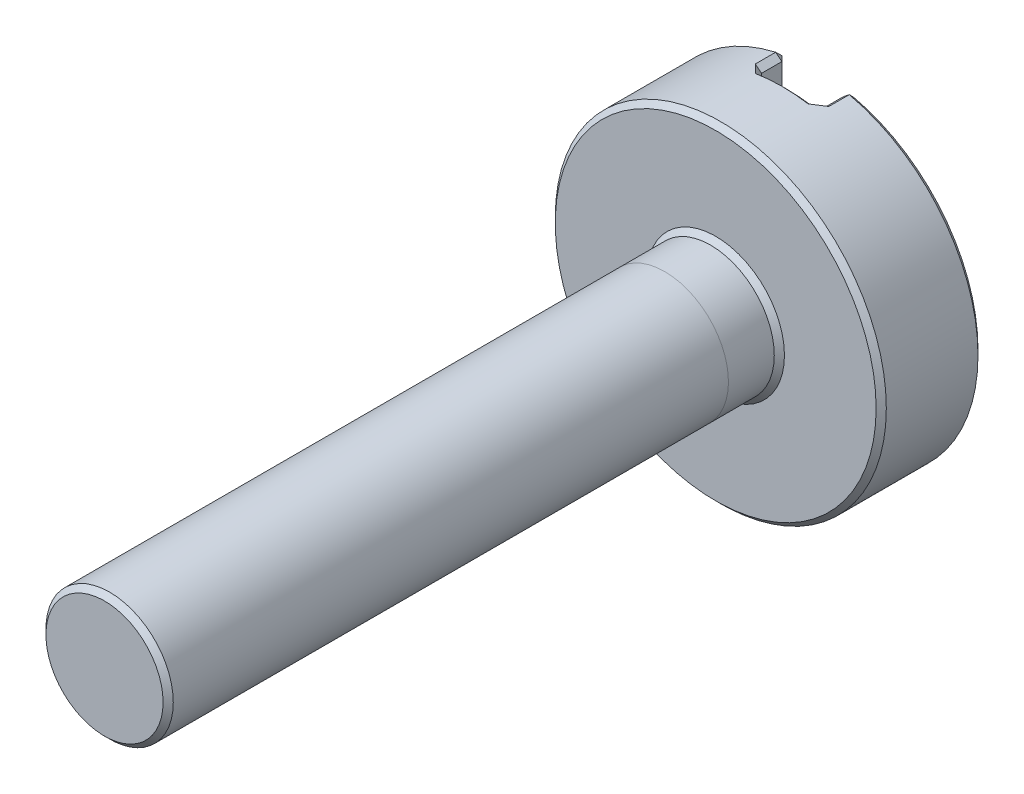
ISO-10303-21;
HEADER;
FILE_DESCRIPTION(('STEP AP214'),'2;1');
FILE_NAME('part.step','',(''),(''),'','','');
FILE_SCHEMA(('AUTOMOTIVE_DESIGN { 1 0 10303 214 1 1 1 1 }'));
ENDSEC;
DATA;
#1=APPLICATION_CONTEXT('core data for automotive mechanical design processes');
#2=APPLICATION_PROTOCOL_DEFINITION('international standard','automotive_design',2000,#1);
#3=PRODUCT_CONTEXT('',#1,'mechanical');
#4=PRODUCT('Part','Part','',(#3));
#5=PRODUCT_RELATED_PRODUCT_CATEGORY('part','',(#4));
#6=PRODUCT_DEFINITION_FORMATION('','',#4);
#7=PRODUCT_DEFINITION_CONTEXT('part definition',#1,'design');
#8=PRODUCT_DEFINITION('design','',#6,#7);
#9=PRODUCT_DEFINITION_SHAPE('','',#8);
#10=(LENGTH_UNIT() NAMED_UNIT(*) SI_UNIT(.MILLI.,.METRE.));
#11=(NAMED_UNIT(*) PLANE_ANGLE_UNIT() SI_UNIT($,.RADIAN.));
#12=(NAMED_UNIT(*) SI_UNIT($,.STERADIAN.) SOLID_ANGLE_UNIT());
#13=UNCERTAINTY_MEASURE_WITH_UNIT(LENGTH_MEASURE(1.E-05),#10,'distance_accuracy_value','');
#14=(GEOMETRIC_REPRESENTATION_CONTEXT(3) GLOBAL_UNCERTAINTY_ASSIGNED_CONTEXT((#13)) GLOBAL_UNIT_ASSIGNED_CONTEXT((#10,
#11,#12)) REPRESENTATION_CONTEXT('',''));
#15=CARTESIAN_POINT('',(0.,0.,0.));
#16=DIRECTION('',(0.,0.,1.));
#17=DIRECTION('',(1.,0.,0.));
#18=AXIS2_PLACEMENT_3D('',#15,#16,#17);
#19=CARTESIAN_POINT('',(0.,0.,7.));
#20=DIRECTION('',(0.,0.,-1.));
#21=DIRECTION('',(-1.,0.,0.));
#22=AXIS2_PLACEMENT_3D('',#19,#20,#21);
#23=CYLINDRICAL_SURFACE('',#22,0.625);
#24=CARTESIAN_POINT('',(0.,0.,6.95));
#25=DIRECTION('',(0.,0.,1.));
#26=DIRECTION('',(1.,0.,0.));
#27=AXIS2_PLACEMENT_3D('',#24,#25,#26);
#28=CIRCLE('',#27,0.625);
#29=CARTESIAN_POINT('',(0.625,0.,6.95));
#30=VERTEX_POINT('',#29);
#31=EDGE_CURVE('E204',#30,#30,#28,.F.);
#32=ORIENTED_EDGE('',*,*,#31,.T.);
#33=EDGE_LOOP('',(#32));
#34=FACE_BOUND('',#33,.T.);
#35=CARTESIAN_POINT('',(0.,0.,1.5));
#36=DIRECTION('',(0.,0.,-1.));
#37=DIRECTION('',(0.,1.,0.));
#38=AXIS2_PLACEMENT_3D('',#35,#36,#37);
#39=CIRCLE('',#38,0.625);
#40=CARTESIAN_POINT('',(0.,0.625,1.5));
#41=VERTEX_POINT('',#40);
#42=EDGE_CURVE('E11',#41,#41,#39,.T.);
#43=ORIENTED_EDGE('',*,*,#42,.F.);
#44=EDGE_LOOP('',(#43));
#45=FACE_BOUND('',#44,.T.);
#46=ADVANCED_FACE('F41',(#34,#45),#23,.T.);
#47=CARTESIAN_POINT('',(0.,0.,1.));
#48=DIRECTION('',(0.,0.,-1.));
#49=DIRECTION('',(-1.,0.,0.));
#50=AXIS2_PLACEMENT_3D('',#47,#48,#49);
#51=CYLINDRICAL_SURFACE('',#50,1.625);
#52=CARTESIAN_POINT('',(0.,0.,0.949999999999998));
#53=DIRECTION('',(0.,0.,1.));
#54=DIRECTION('',(1.,0.,0.));
#55=AXIS2_PLACEMENT_3D('',#52,#53,#54);
#56=CIRCLE('',#55,1.625);
#57=CARTESIAN_POINT('',(1.625,0.,0.949999999999998));
#58=VERTEX_POINT('',#57);
#59=EDGE_CURVE('E51',#58,#58,#56,.F.);
#60=ORIENTED_EDGE('',*,*,#59,.T.);
#61=EDGE_LOOP('',(#60));
#62=FACE_BOUND('',#61,.T.);
#63=CARTESIAN_POINT('',(-0.361111111111113,1.5843685699458,0.249999999999998));
#64=CARTESIAN_POINT('',(-0.352024673125165,1.58643929385841,0.259105473237547));
#65=CARTESIAN_POINT('',(-0.342896384422854,1.58843780195936,0.268185894910321));
#66=CARTESIAN_POINT('',(-0.324545861794149,1.5922886634834,0.286282585001724));
#67=CARTESIAN_POINT('',(-0.315323627628153,1.59414101653363,0.295298853256632));
#68=CARTESIAN_POINT('',(-0.290172859079825,1.59896384129641,0.31964375448623));
#69=CARTESIAN_POINT('',(-0.274143799850216,1.60179156232275,0.334896855879139));
#70=CARTESIAN_POINT('',(-0.257936507959199,1.604398254138,0.349999999985659));
#71=B_SPLINE_CURVE_WITH_KNOTS('',3,(#63,#64,#65,#66,#67,#68,#69,#70),.UNSPECIFIED.,.F.,.F.,(4,2,
2,4),(0.,0.0390877212349878,0.0781755421865645,0.145089052870149),.UNSPECIFIED.);
#72=CARTESIAN_POINT('',(-0.361111111111113,1.5843685699458,0.249999999999998));
#73=VERTEX_POINT('',#72);
#74=CARTESIAN_POINT('',(-0.257936507936506,1.60439825413565,0.350000000000002));
#75=VERTEX_POINT('',#74);
#76=EDGE_CURVE('E532',#73,#75,#71,.T.);
#77=ORIENTED_EDGE('',*,*,#76,.F.);
#78=DIRECTION('',(0.,0.,-1.));
#79=VECTOR('',#78,1.);
#80=CARTESIAN_POINT('',(-0.361111111111113,1.5843685699458,1.));
#81=LINE('',#80,#79);
#82=CARTESIAN_POINT('',(-0.361111111111113,1.5843685699458,0.0500000000000016));
#83=VERTEX_POINT('',#82);
#84=EDGE_CURVE('E538',#73,#83,#81,.T.);
#85=ORIENTED_EDGE('',*,*,#84,.T.);
#86=CARTESIAN_POINT('',(0.,0.,0.0500000000000016));
#87=DIRECTION('',(0.,0.,1.));
#88=DIRECTION('',(1.,0.,0.));
#89=AXIS2_PLACEMENT_3D('',#86,#87,#88);
#90=CIRCLE('',#89,1.625);
#91=CARTESIAN_POINT('',(-0.361111111111113,-1.5843685699458,0.0500000000000016));
#92=VERTEX_POINT('',#91);
#93=EDGE_CURVE('E618',#83,#92,#90,.T.);
#94=ORIENTED_EDGE('',*,*,#93,.T.);
#95=DIRECTION('',(0.,0.,-1.));
#96=VECTOR('',#95,1.);
#97=CARTESIAN_POINT('',(-0.361111111111113,-1.5843685699458,1.));
#98=LINE('',#97,#96);
#99=CARTESIAN_POINT('',(-0.361111111111113,-1.5843685699458,0.249999999999998));
#100=VERTEX_POINT('',#99);
#101=EDGE_CURVE('E580',#92,#100,#98,.F.);
#102=ORIENTED_EDGE('',*,*,#101,.T.);
#103=CARTESIAN_POINT('',(-0.257936507936506,-1.60439825413565,0.350000000000002));
#104=CARTESIAN_POINT('',(-0.267404743278861,-1.60287577243136,0.341179009821983));
#105=CARTESIAN_POINT('',(-0.27681149504785,-1.60127770693172,0.33230569639603));
#106=CARTESIAN_POINT('',(-0.29551300919929,-1.59793229896715,0.314469692080766));
#107=CARTESIAN_POINT('',(-0.304807772175425,-1.59618495729396,0.305507001665728));
#108=CARTESIAN_POINT('',(-0.329877062693198,-1.59124653917794,0.281100804078021));
#109=CARTESIAN_POINT('',(-0.345554186823829,-1.587913184409,0.265585674105172));
#110=CARTESIAN_POINT('',(-0.361111111119896,-1.58436856994723,0.24999999999455));
#111=B_SPLINE_CURVE_WITH_KNOTS('',3,(#103,#104,#105,#106,#107,#108,#109,#110),.UNSPECIFIED.,.F.,
.F.,(4,2,2,4),(0.,0.0390881748208134,0.0781761423329269,0.145089369453429),.UNSPECIFIED.);
#112=CARTESIAN_POINT('',(-0.257936507936506,-1.60439825413565,0.350000000000002));
#113=VERTEX_POINT('',#112);
#114=EDGE_CURVE('E573',#113,#100,#111,.T.);
#115=ORIENTED_EDGE('',*,*,#114,.F.);
#116=CARTESIAN_POINT('',(0.,0.,0.350000000000002));
#117=DIRECTION('',(0.,0.,-1.));
#118=DIRECTION('',(-1.,0.,0.));
#119=AXIS2_PLACEMENT_3D('',#116,#117,#118);
#120=CIRCLE('',#119,1.625);
#121=CARTESIAN_POINT('',(0.257936507936506,-1.60439825413565,0.350000000000002));
#122=VERTEX_POINT('',#121);
#123=EDGE_CURVE('E632',#113,#122,#120,.F.);
#124=ORIENTED_EDGE('',*,*,#123,.T.);
#125=CARTESIAN_POINT('',(0.361111111111113,-1.5843685699458,0.249999999999998));
#126=CARTESIAN_POINT('',(0.352024673125165,-1.58643929385841,0.259105473237547));
#127=CARTESIAN_POINT('',(0.342896384422854,-1.58843780195936,0.268185894910321));
#128=CARTESIAN_POINT('',(0.324545861794149,-1.5922886634834,0.286282585001724));
#129=CARTESIAN_POINT('',(0.315323627628153,-1.59414101653363,0.295298853256632));
#130=CARTESIAN_POINT('',(0.290172859079825,-1.59896384129641,0.31964375448623));
#131=CARTESIAN_POINT('',(0.274143799850216,-1.60179156232275,0.334896855879139));
#132=CARTESIAN_POINT('',(0.257936507959199,-1.604398254138,0.349999999985659));
#133=B_SPLINE_CURVE_WITH_KNOTS('',3,(#125,#126,#127,#128,#129,#130,#131,#132),.UNSPECIFIED.,.F.,
.F.,(4,2,2,4),(0.,0.0390877212349878,0.0781755421865645,0.145089052870149),.UNSPECIFIED.);
#134=CARTESIAN_POINT('',(0.361111111111113,-1.5843685699458,0.249999999999998));
#135=VERTEX_POINT('',#134);
#136=EDGE_CURVE('E148',#135,#122,#133,.T.);
#137=ORIENTED_EDGE('',*,*,#136,.F.);
#138=DIRECTION('',(0.,0.,-1.));
#139=VECTOR('',#138,1.);
#140=CARTESIAN_POINT('',(0.361111111111113,-1.5843685699458,1.));
#141=LINE('',#140,#139);
#142=CARTESIAN_POINT('',(0.361111111111113,-1.5843685699458,0.0500000000000016));
#143=VERTEX_POINT('',#142);
#144=EDGE_CURVE('E143',#135,#143,#141,.T.);
#145=ORIENTED_EDGE('',*,*,#144,.T.);
#146=CARTESIAN_POINT('',(0.,0.,0.0500000000000016));
#147=DIRECTION('',(0.,0.,1.));
#148=DIRECTION('',(1.,0.,0.));
#149=AXIS2_PLACEMENT_3D('',#146,#147,#148);
#150=CIRCLE('',#149,1.625);
#151=CARTESIAN_POINT('',(0.361111111111113,1.5843685699458,0.0500000000000016));
#152=VERTEX_POINT('',#151);
#153=EDGE_CURVE('E146',#143,#152,#150,.T.);
#154=ORIENTED_EDGE('',*,*,#153,.T.);
#155=DIRECTION('',(0.,0.,-1.));
#156=VECTOR('',#155,1.);
#157=CARTESIAN_POINT('',(0.361111111111113,1.5843685699458,1.));
#158=LINE('',#157,#156);
#159=CARTESIAN_POINT('',(0.361111111111113,1.5843685699458,0.249999999999998));
#160=VERTEX_POINT('',#159);
#161=EDGE_CURVE('E153',#152,#160,#158,.F.);
#162=ORIENTED_EDGE('',*,*,#161,.T.);
#163=CARTESIAN_POINT('',(0.257936507936506,1.60439825413565,0.350000000000002));
#164=CARTESIAN_POINT('',(0.267404743278861,1.60287577243136,0.341179009821983));
#165=CARTESIAN_POINT('',(0.27681149504785,1.60127770693172,0.33230569639603));
#166=CARTESIAN_POINT('',(0.29551300919929,1.59793229896715,0.314469692080766));
#167=CARTESIAN_POINT('',(0.304807772175425,1.59618495729396,0.305507001665728));
#168=CARTESIAN_POINT('',(0.329877062693198,1.59124653917794,0.281100804078021));
#169=CARTESIAN_POINT('',(0.345554186823829,1.587913184409,0.265585674105172));
#170=CARTESIAN_POINT('',(0.361111111119896,1.58436856994723,0.24999999999455));
#171=B_SPLINE_CURVE_WITH_KNOTS('',3,(#163,#164,#165,#166,#167,#168,#169,#170),.UNSPECIFIED.,.F.,
.F.,(4,2,2,4),(0.,0.0390881748208134,0.0781761423329269,0.145089369453429),.UNSPECIFIED.);
#172=CARTESIAN_POINT('',(0.257936507936506,1.60439825413565,0.350000000000002));
#173=VERTEX_POINT('',#172);
#174=EDGE_CURVE('E566',#173,#160,#171,.T.);
#175=ORIENTED_EDGE('',*,*,#174,.F.);
#176=CARTESIAN_POINT('',(0.,0.,0.350000000000002));
#177=DIRECTION('',(0.,0.,-1.));
#178=DIRECTION('',(-1.,0.,0.));
#179=AXIS2_PLACEMENT_3D('',#176,#177,#178);
#180=CIRCLE('',#179,1.625);
#181=EDGE_CURVE('E412',#173,#75,#180,.F.);
#182=ORIENTED_EDGE('',*,*,#181,.T.);
#183=EDGE_LOOP('',(#77,#85,#94,#102,#115,#124,#137,#145,#154,#162,#175,#182));
#184=FACE_BOUND('',#183,.T.);
#185=ADVANCED_FACE('F145',(#62,#184),#51,.T.);
#186=CARTESIAN_POINT('',(0.,0.,0.));
#187=DIRECTION('',(0.,0.,1.));
#188=DIRECTION('',(1.,0.,0.));
#189=AXIS2_PLACEMENT_3D('',#186,#187,#188);
#190=PLANE('',#189);
#191=CARTESIAN_POINT('',(0.,0.,0.));
#192=DIRECTION('',(0.,0.,1.));
#193=DIRECTION('',(1.,0.,0.));
#194=AXIS2_PLACEMENT_3D('',#191,#192,#193);
#195=CIRCLE('',#194,1.575);
#196=CARTESIAN_POINT('',(0.350000000000001,1.53561876779362,0.));
#197=VERTEX_POINT('',#196);
#198=CARTESIAN_POINT('',(0.350000000000001,-1.53561876779362,0.));
#199=VERTEX_POINT('',#198);
#200=EDGE_CURVE('E57',#197,#199,#195,.F.);
#201=ORIENTED_EDGE('',*,*,#200,.T.);
#202=DIRECTION('',(0.,1.,0.));
#203=VECTOR('',#202,1.);
#204=CARTESIAN_POINT('',(0.350000000000001,0.,0.));
#205=LINE('',#204,#203);
#206=EDGE_CURVE('E201',#199,#197,#205,.T.);
#207=ORIENTED_EDGE('',*,*,#206,.T.);
#208=EDGE_LOOP('',(#201,#207));
#209=FACE_BOUND('',#208,.T.);
#210=ADVANCED_FACE('F236',(#209),#190,.F.);
#211=ORIENTED_EDGE('',*,*,#42,.T.);
#212=EDGE_LOOP('',(#211));
#213=FACE_BOUND('',#212,.T.);
#214=CARTESIAN_POINT('',(0.,0.,1.05));
#215=DIRECTION('',(0.,0.,1.));
#216=DIRECTION('',(1.,0.,0.));
#217=AXIS2_PLACEMENT_3D('',#214,#215,#216);
#218=CIRCLE('',#217,0.625);
#219=CARTESIAN_POINT('',(0.625,0.,1.05));
#220=VERTEX_POINT('',#219);
#221=EDGE_CURVE('E200',#220,#220,#218,.T.);
#222=ORIENTED_EDGE('',*,*,#221,.T.);
#223=EDGE_LOOP('',(#222));
#224=FACE_BOUND('',#223,.T.);
#225=ADVANCED_FACE('F234',(#213,#224),#23,.T.);
#226=CARTESIAN_POINT('',(0.,0.,7.));
#227=DIRECTION('',(0.,0.,1.));
#228=DIRECTION('',(1.,0.,0.));
#229=AXIS2_PLACEMENT_3D('',#226,#227,#228);
#230=PLANE('',#229);
#231=CARTESIAN_POINT('',(0.,0.,7.));
#232=DIRECTION('',(0.,0.,1.));
#233=DIRECTION('',(1.,0.,0.));
#234=AXIS2_PLACEMENT_3D('',#231,#232,#233);
#235=CIRCLE('',#234,0.575);
#236=CARTESIAN_POINT('',(0.575,0.,7.));
#237=VERTEX_POINT('',#236);
#238=EDGE_CURVE('E197',#237,#237,#235,.T.);
#239=ORIENTED_EDGE('',*,*,#238,.T.);
#240=EDGE_LOOP('',(#239));
#241=FACE_BOUND('',#240,.T.);
#242=ADVANCED_FACE('F226',(#241),#230,.T.);
#243=CARTESIAN_POINT('',(0.,0.,1.));
#244=DIRECTION('',(0.,0.,1.));
#245=DIRECTION('',(1.,0.,0.));
#246=AXIS2_PLACEMENT_3D('',#243,#244,#245);
#247=PLANE('',#246);
#248=CARTESIAN_POINT('',(0.,0.,1.));
#249=DIRECTION('',(0.,0.,1.));
#250=DIRECTION('',(1.,0.,0.));
#251=AXIS2_PLACEMENT_3D('',#248,#249,#250);
#252=CIRCLE('',#251,1.575);
#253=CARTESIAN_POINT('',(1.575,0.,1.));
#254=VERTEX_POINT('',#253);
#255=EDGE_CURVE('E210',#254,#254,#252,.T.);
#256=ORIENTED_EDGE('',*,*,#255,.T.);
#257=EDGE_LOOP('',(#256));
#258=FACE_BOUND('',#257,.T.);
#259=CARTESIAN_POINT('',(0.,0.,1.));
#260=DIRECTION('',(0.,0.,1.));
#261=DIRECTION('',(1.,0.,0.));
#262=AXIS2_PLACEMENT_3D('',#259,#260,#261);
#263=CIRCLE('',#262,0.675);
#264=CARTESIAN_POINT('',(0.675,0.,1.));
#265=VERTEX_POINT('',#264);
#266=EDGE_CURVE('E207',#265,#265,#263,.F.);
#267=ORIENTED_EDGE('',*,*,#266,.T.);
#268=EDGE_LOOP('',(#267));
#269=FACE_BOUND('',#268,.T.);
#270=ADVANCED_FACE('F222',(#258,#269),#247,.T.);
#271=CARTESIAN_POINT('',(0.,0.,0.));
#272=DIRECTION('',(0.,0.,1.));
#273=DIRECTION('',(1.,0.,0.));
#274=AXIS2_PLACEMENT_3D('',#271,#272,#273);
#275=CIRCLE('',#274,1.575);
#276=CARTESIAN_POINT('',(-0.350000000000001,-1.53561876779362,0.));
#277=VERTEX_POINT('',#276);
#278=CARTESIAN_POINT('',(-0.350000000000001,1.53561876779362,0.));
#279=VERTEX_POINT('',#278);
#280=EDGE_CURVE('E430',#277,#279,#275,.F.);
#281=ORIENTED_EDGE('',*,*,#280,.T.);
#282=DIRECTION('',(0.,-1.,0.));
#283=VECTOR('',#282,1.);
#284=CARTESIAN_POINT('',(-0.350000000000001,0.,0.));
#285=LINE('',#284,#283);
#286=EDGE_CURVE('E432',#279,#277,#285,.T.);
#287=ORIENTED_EDGE('',*,*,#286,.T.);
#288=EDGE_LOOP('',(#281,#287));
#289=FACE_BOUND('',#288,.T.);
#290=ADVANCED_FACE('F225',(#289),#190,.F.);
#291=CARTESIAN_POINT('',(0.,0.,0.3));
#292=DIRECTION('',(0.,0.,-1.));
#293=DIRECTION('',(-1.,0.,0.));
#294=AXIS2_PLACEMENT_3D('',#291,#292,#293);
#295=PLANE('',#294);
#296=CARTESIAN_POINT('',(0.,0.,0.3));
#297=DIRECTION('',(0.,0.,-1.));
#298=DIRECTION('',(-1.,0.,0.));
#299=AXIS2_PLACEMENT_3D('',#296,#297,#298);
#300=CIRCLE('',#299,1.575);
#301=CARTESIAN_POINT('',(0.249999999999998,-1.5550321540084,0.3));
#302=VERTEX_POINT('',#301);
#303=CARTESIAN_POINT('',(-0.249999999999998,-1.5550321540084,0.3));
#304=VERTEX_POINT('',#303);
#305=EDGE_CURVE('E421',#302,#304,#300,.T.);
#306=ORIENTED_EDGE('',*,*,#305,.T.);
#307=DIRECTION('',(0.,1.,0.));
#308=VECTOR('',#307,1.);
#309=CARTESIAN_POINT('',(-0.249999999999998,0.,0.3));
#310=LINE('',#309,#308);
#311=CARTESIAN_POINT('',(-0.249999999999998,1.5550321540084,0.3));
#312=VERTEX_POINT('',#311);
#313=EDGE_CURVE('E423',#304,#312,#310,.T.);
#314=ORIENTED_EDGE('',*,*,#313,.T.);
#315=CARTESIAN_POINT('',(0.,0.,0.3));
#316=DIRECTION('',(0.,0.,-1.));
#317=DIRECTION('',(-1.,0.,0.));
#318=AXIS2_PLACEMENT_3D('',#315,#316,#317);
#319=CIRCLE('',#318,1.575);
#320=CARTESIAN_POINT('',(0.249999999999998,1.5550321540084,0.3));
#321=VERTEX_POINT('',#320);
#322=EDGE_CURVE('E410',#312,#321,#319,.T.);
#323=ORIENTED_EDGE('',*,*,#322,.T.);
#324=DIRECTION('',(0.,-1.,0.));
#325=VECTOR('',#324,1.);
#326=CARTESIAN_POINT('',(0.249999999999998,0.,0.3));
#327=LINE('',#326,#325);
#328=EDGE_CURVE('E418',#321,#302,#327,.T.);
#329=ORIENTED_EDGE('',*,*,#328,.T.);
#330=EDGE_LOOP('',(#306,#314,#323,#329));
#331=FACE_BOUND('',#330,.T.);
#332=ADVANCED_FACE('F668',(#331),#295,.T.);
#333=CARTESIAN_POINT('',(0.3,-2.97219755952938,0.3));
#334=DIRECTION('',(1.,0.,0.));
#335=DIRECTION('',(0.,0.,-1.));
#336=AXIS2_PLACEMENT_3D('',#333,#334,#335);
#337=PLANE('',#336);
#338=DIRECTION('',(0.,0.,1.));
#339=VECTOR('',#338,1.);
#340=CARTESIAN_POINT('',(0.3,-1.53561876779362,0.3));
#341=LINE('',#340,#339);
#342=CARTESIAN_POINT('',(0.3,-1.53561876779362,0.0500000000000016));
#343=VERTEX_POINT('',#342);
#344=CARTESIAN_POINT('',(0.3,-1.53561876779362,0.249999999999998));
#345=VERTEX_POINT('',#344);
#346=EDGE_CURVE('E173',#343,#345,#341,.T.);
#347=ORIENTED_EDGE('',*,*,#346,.T.);
#348=DIRECTION('',(0.,1.,0.));
#349=VECTOR('',#348,1.);
#350=CARTESIAN_POINT('',(0.3,-2.97219755952938,0.249999999999998));
#351=LINE('',#350,#349);
#352=CARTESIAN_POINT('',(0.3,1.53561876779362,0.249999999999998));
#353=VERTEX_POINT('',#352);
#354=EDGE_CURVE('E425',#345,#353,#351,.T.);
#355=ORIENTED_EDGE('',*,*,#354,.T.);
#356=DIRECTION('',(0.,0.,-1.));
#357=VECTOR('',#356,1.);
#358=CARTESIAN_POINT('',(0.3,1.53561876779362,0.3));
#359=LINE('',#358,#357);
#360=CARTESIAN_POINT('',(0.3,1.53561876779362,0.0500000000000016));
#361=VERTEX_POINT('',#360);
#362=EDGE_CURVE('E658',#353,#361,#359,.T.);
#363=ORIENTED_EDGE('',*,*,#362,.T.);
#364=DIRECTION('',(0.,-1.,0.));
#365=VECTOR('',#364,1.);
#366=CARTESIAN_POINT('',(0.3,-2.97219755952938,0.0500000000000016));
#367=LINE('',#366,#365);
#368=EDGE_CURVE('E654',#361,#343,#367,.T.);
#369=ORIENTED_EDGE('',*,*,#368,.T.);
#370=EDGE_LOOP('',(#347,#355,#363,#369));
#371=FACE_BOUND('',#370,.T.);
#372=ADVANCED_FACE('F662',(#371),#337,.F.);
#373=CARTESIAN_POINT('',(-0.3,-2.97219755952938,0.3));
#374=DIRECTION('',(-1.,0.,0.));
#375=DIRECTION('',(0.,0.,1.));
#376=AXIS2_PLACEMENT_3D('',#373,#374,#375);
#377=PLANE('',#376);
#378=DIRECTION('',(0.,0.,1.));
#379=VECTOR('',#378,1.);
#380=CARTESIAN_POINT('',(-0.3,1.53561876779362,0.3));
#381=LINE('',#380,#379);
#382=CARTESIAN_POINT('',(-0.3,1.53561876779362,0.0500000000000016));
#383=VERTEX_POINT('',#382);
#384=CARTESIAN_POINT('',(-0.3,1.53561876779362,0.249999999999998));
#385=VERTEX_POINT('',#384);
#386=EDGE_CURVE('E540',#383,#385,#381,.T.);
#387=ORIENTED_EDGE('',*,*,#386,.T.);
#388=DIRECTION('',(0.,-1.,0.));
#389=VECTOR('',#388,1.);
#390=CARTESIAN_POINT('',(-0.3,-2.97219755952938,0.249999999999998));
#391=LINE('',#390,#389);
#392=CARTESIAN_POINT('',(-0.3,-1.53561876779362,0.249999999999998));
#393=VERTEX_POINT('',#392);
#394=EDGE_CURVE('E652',#385,#393,#391,.T.);
#395=ORIENTED_EDGE('',*,*,#394,.T.);
#396=DIRECTION('',(0.,0.,-1.));
#397=VECTOR('',#396,1.);
#398=CARTESIAN_POINT('',(-0.3,-1.53561876779362,0.3));
#399=LINE('',#398,#397);
#400=CARTESIAN_POINT('',(-0.3,-1.53561876779362,0.0500000000000016));
#401=VERTEX_POINT('',#400);
#402=EDGE_CURVE('E650',#393,#401,#399,.T.);
#403=ORIENTED_EDGE('',*,*,#402,.T.);
#404=DIRECTION('',(0.,1.,0.));
#405=VECTOR('',#404,1.);
#406=CARTESIAN_POINT('',(-0.3,-2.97219755952938,0.0500000000000016));
#407=LINE('',#406,#405);
#408=EDGE_CURVE('E537',#401,#383,#407,.T.);
#409=ORIENTED_EDGE('',*,*,#408,.T.);
#410=EDGE_LOOP('',(#387,#395,#403,#409));
#411=FACE_BOUND('',#410,.T.);
#412=ADVANCED_FACE('F286',(#411),#377,.F.);
#413=CARTESIAN_POINT('',(0.3,1.53561876779362,0.0500000000000016));
#414=DIRECTION('',(-0.529150262212924,0.663324958071088,-0.529150262212902));
#415=DIRECTION('',(-0.781735959970572,-0.623609564462323,0.));
#416=AXIS2_PLACEMENT_3D('',#413,#414,#415);
#417=PLANE('',#416);
#418=DIRECTION('',(0.781735959970572,0.623609564462323,0.));
#419=VECTOR('',#418,1.);
#420=CARTESIAN_POINT('',(0.3,1.53561876779362,0.0500000000000016));
#421=LINE('',#420,#419);
#422=EDGE_CURVE('E169',#152,#361,#421,.F.);
#423=ORIENTED_EDGE('',*,*,#422,.F.);
#424=DIRECTION('',(-0.157134840263692,-0.68942631366615,-0.707106781186552));
#425=VECTOR('',#424,1.);
#426=CARTESIAN_POINT('',(0.,0.,-1.57500000000003));
#427=LINE('',#426,#425);
#428=EDGE_CURVE('E159',#197,#152,#427,.F.);
#429=ORIENTED_EDGE('',*,*,#428,.F.);
#430=DIRECTION('',(0.707106781186543,0.,-0.707106781186552));
#431=VECTOR('',#430,1.);
#432=CARTESIAN_POINT('',(0.3,1.53561876779362,0.0500000000000016));
#433=LINE('',#432,#431);
#434=EDGE_CURVE('E193',#361,#197,#433,.T.);
#435=ORIENTED_EDGE('',*,*,#434,.F.);
#436=EDGE_LOOP('',(#423,#429,#435));
#437=FACE_BOUND('',#436,.T.);
#438=ADVANCED_FACE('F275',(#437),#417,.T.);
#439=CARTESIAN_POINT('',(0.,0.,0.0500000000000016));
#440=DIRECTION('',(0.,0.,1.));
#441=DIRECTION('',(1.,0.,0.));
#442=AXIS2_PLACEMENT_3D('',#439,#440,#441);
#443=CONICAL_SURFACE('',#442,1.625,0.785398163397442);
#444=ORIENTED_EDGE('',*,*,#428,.T.);
#445=ORIENTED_EDGE('',*,*,#153,.F.);
#446=DIRECTION('',(0.157134840263692,-0.68942631366615,0.707106781186552));
#447=VECTOR('',#446,1.);
#448=CARTESIAN_POINT('',(0.,0.,-1.57500000000003));
#449=LINE('',#448,#447);
#450=EDGE_CURVE('E157',#199,#143,#449,.T.);
#451=ORIENTED_EDGE('',*,*,#450,.F.);
#452=ORIENTED_EDGE('',*,*,#200,.F.);
#453=EDGE_LOOP('',(#444,#445,#451,#452));
#454=FACE_BOUND('',#453,.T.);
#455=ADVANCED_FACE('F156',(#454),#443,.T.);
#456=CARTESIAN_POINT('',(0.350000000000001,0.,0.));
#457=DIRECTION('',(0.707106781186552,0.,0.707106781186543));
#458=DIRECTION('',(0.,1.,0.));
#459=AXIS2_PLACEMENT_3D('',#456,#457,#458);
#460=PLANE('',#459);
#461=ORIENTED_EDGE('',*,*,#434,.T.);
#462=ORIENTED_EDGE('',*,*,#206,.F.);
#463=DIRECTION('',(-0.707106781186543,0.,0.707106781186552));
#464=VECTOR('',#463,1.);
#465=CARTESIAN_POINT('',(0.330555555555557,-1.53561876779362,0.0194444444444444));
#466=LINE('',#465,#464);
#467=EDGE_CURVE('E168',#343,#199,#466,.F.);
#468=ORIENTED_EDGE('',*,*,#467,.F.);
#469=ORIENTED_EDGE('',*,*,#368,.F.);
#470=EDGE_LOOP('',(#461,#462,#468,#469));
#471=FACE_BOUND('',#470,.T.);
#472=ADVANCED_FACE('F293',(#471),#460,.F.);
#473=CARTESIAN_POINT('',(0.361111111111113,1.5843685699458,1.));
#474=DIRECTION('',(-0.623609564462323,0.781735959970572,0.));
#475=DIRECTION('',(0.,0.,-1.));
#476=AXIS2_PLACEMENT_3D('',#473,#474,#475);
#477=PLANE('',#476);
#478=ORIENTED_EDGE('',*,*,#422,.T.);
#479=ORIENTED_EDGE('',*,*,#362,.F.);
#480=DIRECTION('',(-0.781735959970572,-0.623609564462323,0.));
#481=VECTOR('',#480,1.);
#482=CARTESIAN_POINT('',(0.361111111111113,1.5843685699458,0.249999999999998));
#483=LINE('',#482,#481);
#484=EDGE_CURVE('E174',#160,#353,#483,.T.);
#485=ORIENTED_EDGE('',*,*,#484,.F.);
#486=ORIENTED_EDGE('',*,*,#161,.F.);
#487=EDGE_LOOP('',(#478,#479,#485,#486));
#488=FACE_BOUND('',#487,.T.);
#489=ADVANCED_FACE('F299',(#488),#477,.T.);
#490=CARTESIAN_POINT('',(0.361111111111113,-1.5843685699458,0.0500000000000016));
#491=DIRECTION('',(-0.529150262212924,-0.663324958071088,-0.529150262212902));
#492=DIRECTION('',(0.781735959970572,-0.623609564462323,0.));
#493=AXIS2_PLACEMENT_3D('',#490,#491,#492);
#494=PLANE('',#493);
#495=ORIENTED_EDGE('',*,*,#467,.T.);
#496=ORIENTED_EDGE('',*,*,#450,.T.);
#497=DIRECTION('',(0.781735959970572,-0.623609564462323,0.));
#498=VECTOR('',#497,1.);
#499=CARTESIAN_POINT('',(0.361111111111113,-1.5843685699458,0.0500000000000016));
#500=LINE('',#499,#498);
#501=EDGE_CURVE('E165',#343,#143,#500,.T.);
#502=ORIENTED_EDGE('',*,*,#501,.F.);
#503=EDGE_LOOP('',(#495,#496,#502));
#504=FACE_BOUND('',#503,.T.);
#505=ADVANCED_FACE('F164',(#504),#494,.T.);
#506=CARTESIAN_POINT('',(0.249999999999998,1.5550321540084,0.3));
#507=CARTESIAN_POINT('',(0.3,1.53561876779362,0.249999999999998));
#508=CARTESIAN_POINT('',(0.257936507936506,1.60439825413565,0.350000000000002));
#509=CARTESIAN_POINT('',(0.361111111111113,1.5843685699458,0.249999999999998));
#510=CARTESIAN_POINT('',(0.258112013180639,1.60548991932695,0.35110568303804));
#511=CARTESIAN_POINT('',(0.362462501490938,1.58544660653275,0.249999999999998));
#512=B_SPLINE_SURFACE_WITH_KNOTS('',1,1,((#506,#507),(#508,#509),(#510,#511)),.UNSPECIFIED.,.F.,
.F.,.F.,(2,1,2),(2,2),(0.,1.,1.02211366076077),(0.,1.),.UNSPECIFIED.);
#513=CARTESIAN_POINT('',(0.3,1.53561876779362,0.249999999999998));
#514=CARTESIAN_POINT('',(0.295557947430932,1.53734347343581,0.254442052569066));
#515=CARTESIAN_POINT('',(0.291115894861864,1.53906817907801,0.258884105138134));
#516=CARTESIAN_POINT('',(0.282231789723728,1.54251759036239,0.26776821027627));
#517=CARTESIAN_POINT('',(0.27778973715466,1.54424229600459,0.272210262845338));
#518=CARTESIAN_POINT('',(0.26556512305706,1.54898871910065,0.284434876942938));
#519=CARTESIAN_POINT('',(0.257782561528529,1.55201043655452,0.292217438471469));
#520=CARTESIAN_POINT('',(0.249999999999998,1.5550321540084,0.3));
#521=B_SPLINE_CURVE_WITH_KNOTS('',3,(#513,#514,#515,#516,#517,#518,#519,#520),.UNSPECIFIED.,.F.,
.F.,(4,2,2,4),(0.,0.019543398999265,0.03908679799853,0.073327208894956),.UNSPECIFIED.);
#522=EDGE_CURVE('E175',#321,#353,#521,.F.);
#523=DIRECTION('',(0.112239171616911,0.69814208321426,0.707106781186549));
#524=VECTOR('',#523,1.);
#525=CARTESIAN_POINT('',(0.249999999999998,1.5550321540084,0.3));
#526=LINE('',#525,#524);
#527=EDGE_CURVE('E180',#173,#321,#526,.F.);
#528=ORIENTED_EDGE('',*,*,#174,.T.);
#529=ORIENTED_EDGE('',*,*,#484,.T.);
#530=ORIENTED_EDGE('',*,*,#522,.F.);
#531=ORIENTED_EDGE('',*,*,#527,.F.);
#532=EDGE_LOOP('',(#528,#529,#530,#531));
#533=FACE_BOUND('',#532,.T.);
#534=ADVANCED_FACE('F312',(#533),#512,.T.);
#535=CARTESIAN_POINT('',(0.361111111111113,-1.5843685699458,1.));
#536=DIRECTION('',(0.623609564462323,0.781735959970572,0.));
#537=DIRECTION('',(0.,0.,-1.));
#538=AXIS2_PLACEMENT_3D('',#535,#536,#537);
#539=PLANE('',#538);
#540=ORIENTED_EDGE('',*,*,#501,.T.);
#541=ORIENTED_EDGE('',*,*,#144,.F.);
#542=DIRECTION('',(0.781735959970572,-0.623609564462323,0.));
#543=VECTOR('',#542,1.);
#544=CARTESIAN_POINT('',(0.3,-1.53561876779362,0.249999999999998));
#545=LINE('',#544,#543);
#546=EDGE_CURVE('E398',#345,#135,#545,.T.);
#547=ORIENTED_EDGE('',*,*,#546,.F.);
#548=ORIENTED_EDGE('',*,*,#346,.F.);
#549=EDGE_LOOP('',(#540,#541,#547,#548));
#550=FACE_BOUND('',#549,.T.);
#551=ADVANCED_FACE('F171',(#550),#539,.F.);
#552=CARTESIAN_POINT('',(0.249999999999998,0.,0.3));
#553=DIRECTION('',(0.707106781186547,0.,0.707106781186547));
#554=DIRECTION('',(0.,-1.,0.));
#555=AXIS2_PLACEMENT_3D('',#552,#553,#554);
#556=PLANE('',#555);
#557=ORIENTED_EDGE('',*,*,#522,.T.);
#558=ORIENTED_EDGE('',*,*,#354,.F.);
#559=CARTESIAN_POINT('',(0.249999999999998,-1.5550321540084,0.3));
#560=CARTESIAN_POINT('',(0.254442052569066,-1.5533074483662,0.295557947430932));
#561=CARTESIAN_POINT('',(0.258884105138134,-1.55158274272401,0.291115894861864));
#562=CARTESIAN_POINT('',(0.26776821027627,-1.54813333143962,0.282231789723728));
#563=CARTESIAN_POINT('',(0.272210262845338,-1.54640862579743,0.27778973715466));
#564=CARTESIAN_POINT('',(0.284434876942938,-1.54166220270137,0.265565123057061));
#565=CARTESIAN_POINT('',(0.292217438471469,-1.53864048524749,0.257782561528529));
#566=CARTESIAN_POINT('',(0.3,-1.53561876779362,0.249999999999998));
#567=B_SPLINE_CURVE_WITH_KNOTS('',3,(#559,#560,#561,#562,#563,#564,#565,#566),.UNSPECIFIED.,.F.,
.F.,(4,2,2,4),(0.,0.019543398999265,0.03908679799853,0.073327208894956),.UNSPECIFIED.);
#568=EDGE_CURVE('E391',#302,#345,#567,.T.);
#569=ORIENTED_EDGE('',*,*,#568,.F.);
#570=ORIENTED_EDGE('',*,*,#328,.F.);
#571=EDGE_LOOP('',(#557,#558,#569,#570));
#572=FACE_BOUND('',#571,.T.);
#573=ADVANCED_FACE('F330',(#572),#556,.F.);
#574=CARTESIAN_POINT('',(0.,0.,0.3));
#575=DIRECTION('',(0.,0.,1.));
#576=DIRECTION('',(1.,0.,0.));
#577=AXIS2_PLACEMENT_3D('',#574,#575,#576);
#578=CONICAL_SURFACE('',#577,1.575,0.785398163397448);
#579=ORIENTED_EDGE('',*,*,#527,.T.);
#580=ORIENTED_EDGE('',*,*,#322,.F.);
#581=DIRECTION('',(0.112239171616911,-0.69814208321426,-0.707106781186549));
#582=VECTOR('',#581,1.);
#583=CARTESIAN_POINT('',(-0.257936507936506,1.60439825413565,0.350000000000002));
#584=LINE('',#583,#582);
#585=EDGE_CURVE('E399',#75,#312,#584,.T.);
#586=ORIENTED_EDGE('',*,*,#585,.F.);
#587=ORIENTED_EDGE('',*,*,#181,.F.);
#588=EDGE_LOOP('',(#579,#580,#586,#587));
#589=FACE_BOUND('',#588,.T.);
#590=ADVANCED_FACE('F338',(#589),#578,.T.);
#591=CARTESIAN_POINT('',(-0.361111111111113,1.5843685699458,1.));
#592=DIRECTION('',(-0.623609564462323,-0.781735959970572,0.));
#593=DIRECTION('',(0.,0.,-1.));
#594=AXIS2_PLACEMENT_3D('',#591,#592,#593);
#595=PLANE('',#594);
#596=DIRECTION('',(-0.781735959970572,0.623609564462323,0.));
#597=VECTOR('',#596,1.);
#598=CARTESIAN_POINT('',(-0.361111111111113,1.5843685699458,0.0500000000000016));
#599=LINE('',#598,#597);
#600=EDGE_CURVE('E402',#83,#383,#599,.F.);
#601=ORIENTED_EDGE('',*,*,#600,.F.);
#602=ORIENTED_EDGE('',*,*,#84,.F.);
#603=DIRECTION('',(-0.781735959970572,0.623609564462323,0.));
#604=VECTOR('',#603,1.);
#605=CARTESIAN_POINT('',(-0.3,1.53561876779362,0.249999999999998));
#606=LINE('',#605,#604);
#607=EDGE_CURVE('E535',#385,#73,#606,.T.);
#608=ORIENTED_EDGE('',*,*,#607,.F.);
#609=ORIENTED_EDGE('',*,*,#386,.F.);
#610=EDGE_LOOP('',(#601,#602,#608,#609));
#611=FACE_BOUND('',#610,.T.);
#612=ADVANCED_FACE('F349',(#611),#595,.F.);
#613=CARTESIAN_POINT('',(-0.361111111111113,1.5843685699458,0.0500000000000016));
#614=DIRECTION('',(0.529150262212924,0.663324958071088,-0.529150262212902));
#615=DIRECTION('',(-0.781735959970572,0.623609564462323,0.));
#616=AXIS2_PLACEMENT_3D('',#613,#614,#615);
#617=PLANE('',#616);
#618=DIRECTION('',(-0.157134840263692,0.68942631366615,0.707106781186552));
#619=VECTOR('',#618,1.);
#620=CARTESIAN_POINT('',(0.,0.,-1.57500000000003));
#621=LINE('',#620,#619);
#622=EDGE_CURVE('E621',#83,#279,#621,.F.);
#623=ORIENTED_EDGE('',*,*,#622,.F.);
#624=ORIENTED_EDGE('',*,*,#600,.T.);
#625=DIRECTION('',(0.707106781186543,0.,0.707106781186552));
#626=VECTOR('',#625,1.);
#627=CARTESIAN_POINT('',(-0.330555555555557,1.53561876779362,0.0194444444444444));
#628=LINE('',#627,#626);
#629=EDGE_CURVE('E619',#279,#383,#628,.T.);
#630=ORIENTED_EDGE('',*,*,#629,.F.);
#631=EDGE_LOOP('',(#623,#624,#630));
#632=FACE_BOUND('',#631,.T.);
#633=ADVANCED_FACE('F356',(#632),#617,.T.);
#634=CARTESIAN_POINT('',(0.3,-1.53561876779362,0.249999999999998));
#635=CARTESIAN_POINT('',(0.249999999999998,-1.5550321540084,0.3));
#636=CARTESIAN_POINT('',(0.361111111111113,-1.5843685699458,0.249999999999998));
#637=CARTESIAN_POINT('',(0.257936507936506,-1.60439825413565,0.350000000000002));
#638=CARTESIAN_POINT('',(0.362443431561653,-1.58543139399181,0.249999999999998));
#639=CARTESIAN_POINT('',(0.258109536566446,-1.60547451446813,0.351090080368625));
#640=B_SPLINE_SURFACE_WITH_KNOTS('',1,1,((#634,#635),(#636,#637),(#638,#639)),.UNSPECIFIED.,.F.,
.F.,.F.,(2,1,2),(2,2),(0.,1.,1.02180160737247),(0.,1.),.UNSPECIFIED.);
#641=DIRECTION('',(-0.112239171616911,0.69814208321426,-0.707106781186549));
#642=VECTOR('',#641,1.);
#643=CARTESIAN_POINT('',(0.257936507936506,-1.60439825413565,0.350000000000002));
#644=LINE('',#643,#642);
#645=EDGE_CURVE('E480',#302,#122,#644,.F.);
#646=ORIENTED_EDGE('',*,*,#546,.T.);
#647=ORIENTED_EDGE('',*,*,#136,.T.);
#648=ORIENTED_EDGE('',*,*,#645,.F.);
#649=ORIENTED_EDGE('',*,*,#568,.T.);
#650=EDGE_LOOP('',(#646,#647,#648,#649));
#651=FACE_BOUND('',#650,.T.);
#652=ADVANCED_FACE('F363',(#651),#640,.T.);
#653=CARTESIAN_POINT('',(-0.3,1.53561876779362,0.249999999999998));
#654=CARTESIAN_POINT('',(-0.249999999999998,1.5550321540084,0.3));
#655=CARTESIAN_POINT('',(-0.361111111111113,1.5843685699458,0.249999999999998));
#656=CARTESIAN_POINT('',(-0.257936507936506,1.60439825413565,0.350000000000002));
#657=CARTESIAN_POINT('',(-0.362443431561653,1.58543139399181,0.249999999999998));
#658=CARTESIAN_POINT('',(-0.258109536566446,1.60547451446813,0.351090080368625));
#659=B_SPLINE_SURFACE_WITH_KNOTS('',1,1,((#653,#654),(#655,#656),(#657,#658)),.UNSPECIFIED.,.F.,
.F.,.F.,(2,1,2),(2,2),(0.,1.,1.02180160737247),(0.,1.),.UNSPECIFIED.);
#660=CARTESIAN_POINT('',(-0.249999999999998,1.5550321540084,0.3));
#661=CARTESIAN_POINT('',(-0.254442052569066,1.5533074483662,0.295557947430932));
#662=CARTESIAN_POINT('',(-0.258884105138134,1.55158274272401,0.291115894861864));
#663=CARTESIAN_POINT('',(-0.26776821027627,1.54813333143962,0.282231789723728));
#664=CARTESIAN_POINT('',(-0.272210262845338,1.54640862579743,0.27778973715466));
#665=CARTESIAN_POINT('',(-0.284434876942938,1.54166220270137,0.265565123057061));
#666=CARTESIAN_POINT('',(-0.292217438471469,1.53864048524749,0.257782561528529));
#667=CARTESIAN_POINT('',(-0.3,1.53561876779362,0.249999999999998));
#668=B_SPLINE_CURVE_WITH_KNOTS('',3,(#660,#661,#662,#663,#664,#665,#666,#667),.UNSPECIFIED.,.F.,
.F.,(4,2,2,4),(0.,0.019543398999265,0.03908679799853,0.073327208894956),.UNSPECIFIED.);
#669=EDGE_CURVE('E472',#385,#312,#668,.F.);
#670=ORIENTED_EDGE('',*,*,#76,.T.);
#671=ORIENTED_EDGE('',*,*,#585,.T.);
#672=ORIENTED_EDGE('',*,*,#669,.F.);
#673=ORIENTED_EDGE('',*,*,#607,.T.);
#674=EDGE_LOOP('',(#670,#671,#672,#673));
#675=FACE_BOUND('',#674,.T.);
#676=ADVANCED_FACE('F371',(#675),#659,.T.);
#677=CARTESIAN_POINT('',(-0.350000000000001,0.,0.));
#678=DIRECTION('',(-0.707106781186552,0.,0.707106781186543));
#679=DIRECTION('',(0.,-1.,0.));
#680=AXIS2_PLACEMENT_3D('',#677,#678,#679);
#681=PLANE('',#680);
#682=ORIENTED_EDGE('',*,*,#629,.T.);
#683=ORIENTED_EDGE('',*,*,#408,.F.);
#684=DIRECTION('',(-0.707106781186543,0.,-0.707106781186552));
#685=VECTOR('',#684,1.);
#686=CARTESIAN_POINT('',(-0.3,-1.53561876779362,0.0500000000000016));
#687=LINE('',#686,#685);
#688=EDGE_CURVE('E481',#277,#401,#687,.F.);
#689=ORIENTED_EDGE('',*,*,#688,.F.);
#690=ORIENTED_EDGE('',*,*,#286,.F.);
#691=EDGE_LOOP('',(#682,#683,#689,#690));
#692=FACE_BOUND('',#691,.T.);
#693=ADVANCED_FACE('F509',(#692),#681,.F.);
#694=CARTESIAN_POINT('',(0.,0.,0.0500000000000016));
#695=DIRECTION('',(0.,0.,1.));
#696=DIRECTION('',(1.,0.,0.));
#697=AXIS2_PLACEMENT_3D('',#694,#695,#696);
#698=CONICAL_SURFACE('',#697,1.625,0.785398163397442);
#699=ORIENTED_EDGE('',*,*,#622,.T.);
#700=ORIENTED_EDGE('',*,*,#280,.F.);
#701=DIRECTION('',(0.157134840263692,0.68942631366615,-0.707106781186552));
#702=VECTOR('',#701,1.);
#703=CARTESIAN_POINT('',(0.,0.,-1.57500000000003));
#704=LINE('',#703,#702);
#705=EDGE_CURVE('E638',#92,#277,#704,.T.);
#706=ORIENTED_EDGE('',*,*,#705,.F.);
#707=ORIENTED_EDGE('',*,*,#93,.F.);
#708=EDGE_LOOP('',(#699,#700,#706,#707));
#709=FACE_BOUND('',#708,.T.);
#710=ADVANCED_FACE('F502',(#709),#698,.T.);
#711=CARTESIAN_POINT('',(0.,0.,0.3));
#712=DIRECTION('',(0.,0.,1.));
#713=DIRECTION('',(1.,0.,0.));
#714=AXIS2_PLACEMENT_3D('',#711,#712,#713);
#715=CONICAL_SURFACE('',#714,1.575,0.785398163397448);
#716=ORIENTED_EDGE('',*,*,#645,.T.);
#717=ORIENTED_EDGE('',*,*,#123,.F.);
#718=DIRECTION('',(-0.112239171616911,-0.69814208321426,0.707106781186549));
#719=VECTOR('',#718,1.);
#720=CARTESIAN_POINT('',(-0.249999999999998,-1.5550321540084,0.3));
#721=LINE('',#720,#719);
#722=EDGE_CURVE('E450',#304,#113,#721,.T.);
#723=ORIENTED_EDGE('',*,*,#722,.F.);
#724=ORIENTED_EDGE('',*,*,#305,.F.);
#725=EDGE_LOOP('',(#716,#717,#723,#724));
#726=FACE_BOUND('',#725,.T.);
#727=ADVANCED_FACE('F465',(#726),#715,.T.);
#728=CARTESIAN_POINT('',(-0.249999999999998,0.,0.3));
#729=DIRECTION('',(-0.707106781186547,0.,0.707106781186547));
#730=DIRECTION('',(0.,1.,0.));
#731=AXIS2_PLACEMENT_3D('',#728,#729,#730);
#732=PLANE('',#731);
#733=ORIENTED_EDGE('',*,*,#669,.T.);
#734=ORIENTED_EDGE('',*,*,#313,.F.);
#735=CARTESIAN_POINT('',(-0.3,-1.53561876779362,0.249999999999998));
#736=CARTESIAN_POINT('',(-0.295557947430932,-1.53734347343581,0.254442052569066));
#737=CARTESIAN_POINT('',(-0.291115894861864,-1.53906817907801,0.258884105138134));
#738=CARTESIAN_POINT('',(-0.282231789723728,-1.54251759036239,0.26776821027627));
#739=CARTESIAN_POINT('',(-0.27778973715466,-1.54424229600459,0.272210262845338));
#740=CARTESIAN_POINT('',(-0.26556512305706,-1.54898871910065,0.284434876942938));
#741=CARTESIAN_POINT('',(-0.257782561528529,-1.55201043655452,0.292217438471469));
#742=CARTESIAN_POINT('',(-0.249999999999998,-1.5550321540084,0.3));
#743=B_SPLINE_CURVE_WITH_KNOTS('',3,(#735,#736,#737,#738,#739,#740,#741,#742),.UNSPECIFIED.,.F.,
.F.,(4,2,2,4),(0.,0.019543398999265,0.03908679799853,0.073327208894956),.UNSPECIFIED.);
#744=EDGE_CURVE('E441',#393,#304,#743,.T.);
#745=ORIENTED_EDGE('',*,*,#744,.F.);
#746=ORIENTED_EDGE('',*,*,#394,.F.);
#747=EDGE_LOOP('',(#733,#734,#745,#746));
#748=FACE_BOUND('',#747,.T.);
#749=ADVANCED_FACE('F457',(#748),#732,.F.);
#750=CARTESIAN_POINT('',(-0.3,-1.53561876779362,0.0500000000000016));
#751=DIRECTION('',(0.529150262212924,-0.663324958071088,-0.529150262212902));
#752=DIRECTION('',(0.781735959970572,0.623609564462323,0.));
#753=AXIS2_PLACEMENT_3D('',#750,#751,#752);
#754=PLANE('',#753);
#755=ORIENTED_EDGE('',*,*,#705,.T.);
#756=ORIENTED_EDGE('',*,*,#688,.T.);
#757=DIRECTION('',(-0.781735959970572,-0.623609564462323,0.));
#758=VECTOR('',#757,1.);
#759=CARTESIAN_POINT('',(-0.3,-1.53561876779362,0.0500000000000016));
#760=LINE('',#759,#758);
#761=EDGE_CURVE('E439',#92,#401,#760,.F.);
#762=ORIENTED_EDGE('',*,*,#761,.F.);
#763=EDGE_LOOP('',(#755,#756,#762));
#764=FACE_BOUND('',#763,.T.);
#765=ADVANCED_FACE('F464',(#764),#754,.T.);
#766=CARTESIAN_POINT('',(-0.249999999999998,-1.5550321540084,0.3));
#767=CARTESIAN_POINT('',(-0.3,-1.53561876779362,0.249999999999998));
#768=CARTESIAN_POINT('',(-0.257936507936506,-1.60439825413565,0.350000000000002));
#769=CARTESIAN_POINT('',(-0.361111111111113,-1.5843685699458,0.249999999999998));
#770=CARTESIAN_POINT('',(-0.258112013180639,-1.60548991932695,0.35110568303804));
#771=CARTESIAN_POINT('',(-0.362462501490938,-1.58544660653275,0.249999999999998));
#772=B_SPLINE_SURFACE_WITH_KNOTS('',1,1,((#766,#767),(#768,#769),(#770,#771)),.UNSPECIFIED.,.F.,
.F.,.F.,(2,1,2),(2,2),(0.,1.,1.02211366076077),(0.,1.),.UNSPECIFIED.);
#773=DIRECTION('',(0.781735959970572,0.623609564462323,0.));
#774=VECTOR('',#773,1.);
#775=CARTESIAN_POINT('',(-0.361111111111113,-1.5843685699458,0.249999999999998));
#776=LINE('',#775,#774);
#777=EDGE_CURVE('E437',#393,#100,#776,.F.);
#778=ORIENTED_EDGE('',*,*,#722,.T.);
#779=ORIENTED_EDGE('',*,*,#114,.T.);
#780=ORIENTED_EDGE('',*,*,#777,.F.);
#781=ORIENTED_EDGE('',*,*,#744,.T.);
#782=EDGE_LOOP('',(#778,#779,#780,#781));
#783=FACE_BOUND('',#782,.T.);
#784=ADVANCED_FACE('F265',(#783),#772,.T.);
#785=CARTESIAN_POINT('',(-0.361111111111113,-1.5843685699458,1.));
#786=DIRECTION('',(0.623609564462323,-0.781735959970572,0.));
#787=DIRECTION('',(0.,0.,-1.));
#788=AXIS2_PLACEMENT_3D('',#785,#786,#787);
#789=PLANE('',#788);
#790=ORIENTED_EDGE('',*,*,#761,.T.);
#791=ORIENTED_EDGE('',*,*,#402,.F.);
#792=ORIENTED_EDGE('',*,*,#777,.T.);
#793=ORIENTED_EDGE('',*,*,#101,.F.);
#794=EDGE_LOOP('',(#790,#791,#792,#793));
#795=FACE_BOUND('',#794,.T.);
#796=ADVANCED_FACE('F259',(#795),#789,.T.);
#797=CARTESIAN_POINT('',(0.,0.,7.));
#798=DIRECTION('',(0.,0.,-1.));
#799=DIRECTION('',(-1.,0.,0.));
#800=AXIS2_PLACEMENT_3D('',#797,#798,#799);
#801=CONICAL_SURFACE('',#800,0.575,0.785398163397443);
#802=ORIENTED_EDGE('',*,*,#31,.F.);
#803=EDGE_LOOP('',(#802));
#804=FACE_BOUND('',#803,.T.);
#805=ORIENTED_EDGE('',*,*,#238,.F.);
#806=EDGE_LOOP('',(#805));
#807=FACE_BOUND('',#806,.T.);
#808=ADVANCED_FACE('F219',(#804,#807),#801,.T.);
#809=CARTESIAN_POINT('',(0.,0.,1.));
#810=DIRECTION('',(0.,0.,-1.));
#811=DIRECTION('',(-1.,0.,0.));
#812=AXIS2_PLACEMENT_3D('',#809,#810,#811);
#813=CONICAL_SURFACE('',#812,1.575,0.785398163397448);
#814=ORIENTED_EDGE('',*,*,#59,.F.);
#815=EDGE_LOOP('',(#814));
#816=FACE_BOUND('',#815,.T.);
#817=ORIENTED_EDGE('',*,*,#255,.F.);
#818=EDGE_LOOP('',(#817));
#819=FACE_BOUND('',#818,.T.);
#820=ADVANCED_FACE('F216',(#816,#819),#813,.T.);
#821=CARTESIAN_POINT('',(0.,0.,1.05));
#822=DIRECTION('',(0.,0.,-1.));
#823=DIRECTION('',(-1.,0.,0.));
#824=AXIS2_PLACEMENT_3D('',#821,#822,#823);
#825=CONICAL_SURFACE('',#824,0.625,0.785398163397445);
#826=ORIENTED_EDGE('',*,*,#266,.F.);
#827=EDGE_LOOP('',(#826));
#828=FACE_BOUND('',#827,.T.);
#829=ORIENTED_EDGE('',*,*,#221,.F.);
#830=EDGE_LOOP('',(#829));
#831=FACE_BOUND('',#830,.T.);
#832=ADVANCED_FACE('F44',(#828,#831),#825,.T.);
#833=CLOSED_SHELL('',(#46,#185,#210,#225,#242,#270,#290,#332,#372,#412,#438,#455,#472,#489,#505,
#534,#551,#573,#590,#612,#633,#652,#676,#693,#710,#727,#749,#765,#784,#796,#808,#820,#832));
#834=MANIFOLD_SOLID_BREP('B2',#833);
#835=ADVANCED_BREP_SHAPE_REPRESENTATION('',(#18,#834),#14);
#836=SHAPE_DEFINITION_REPRESENTATION(#9,#835);
ENDSEC;
END-ISO-10303-21;
